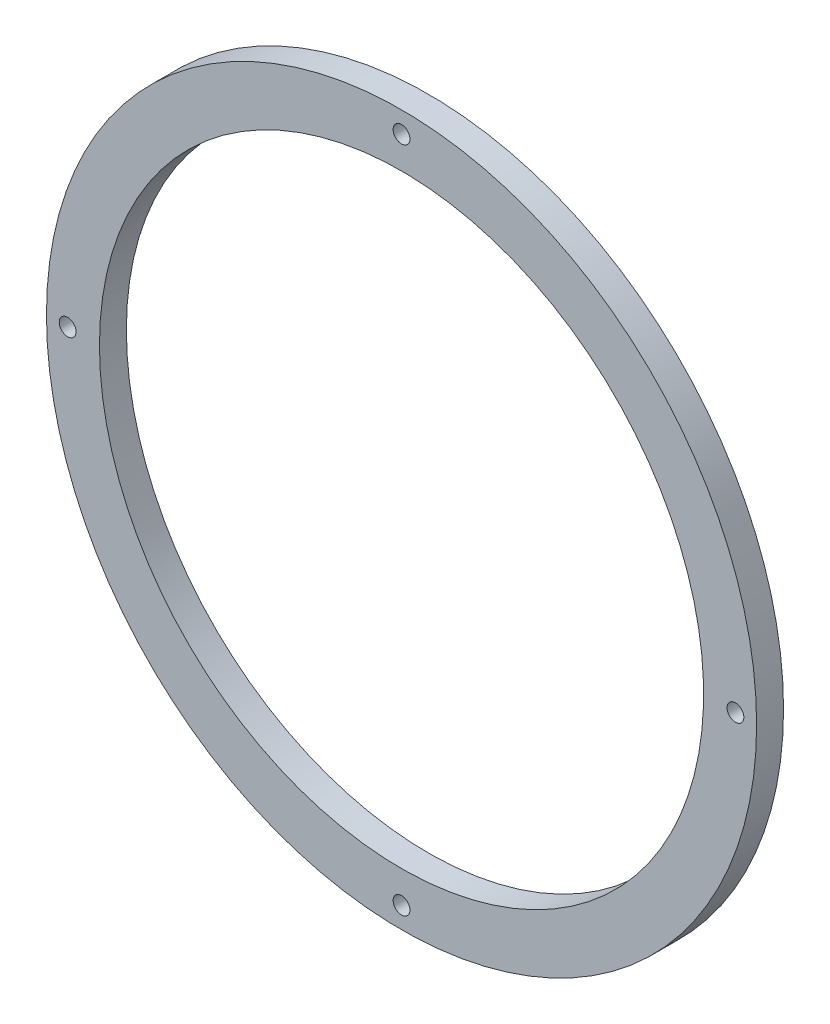
ISO-10303-21;
HEADER;
FILE_DESCRIPTION(('STEP AP214'),'2;1');
FILE_NAME('part.step','',(''),(''),'','','');
FILE_SCHEMA(('AUTOMOTIVE_DESIGN { 1 0 10303 214 1 1 1 1 }'));
ENDSEC;
DATA;
#1=APPLICATION_CONTEXT('core data for automotive mechanical design processes');
#2=APPLICATION_PROTOCOL_DEFINITION('international standard','automotive_design',2000,#1);
#3=PRODUCT_CONTEXT('',#1,'mechanical');
#4=PRODUCT('Part','Part','',(#3));
#5=PRODUCT_RELATED_PRODUCT_CATEGORY('part','',(#4));
#6=PRODUCT_DEFINITION_FORMATION('','',#4);
#7=PRODUCT_DEFINITION_CONTEXT('part definition',#1,'design');
#8=PRODUCT_DEFINITION('design','',#6,#7);
#9=PRODUCT_DEFINITION_SHAPE('','',#8);
#10=(LENGTH_UNIT() NAMED_UNIT(*) SI_UNIT(.MILLI.,.METRE.));
#11=(NAMED_UNIT(*) PLANE_ANGLE_UNIT() SI_UNIT($,.RADIAN.));
#12=(NAMED_UNIT(*) SI_UNIT($,.STERADIAN.) SOLID_ANGLE_UNIT());
#13=UNCERTAINTY_MEASURE_WITH_UNIT(LENGTH_MEASURE(1.E-05),#10,'distance_accuracy_value','');
#14=(GEOMETRIC_REPRESENTATION_CONTEXT(3) GLOBAL_UNCERTAINTY_ASSIGNED_CONTEXT((#13)) GLOBAL_UNIT_ASSIGNED_CONTEXT((#10,
#11,#12)) REPRESENTATION_CONTEXT('',''));
#15=CARTESIAN_POINT('',(0.,0.,0.));
#16=DIRECTION('',(0.,0.,1.));
#17=DIRECTION('',(1.,0.,0.));
#18=AXIS2_PLACEMENT_3D('',#15,#16,#17);
#19=CARTESIAN_POINT('',(0.,0.,7.62));
#20=DIRECTION('',(0.,0.,1.));
#21=DIRECTION('',(1.,0.,0.));
#22=AXIS2_PLACEMENT_3D('',#19,#20,#21);
#23=PLANE('',#22);
#24=CARTESIAN_POINT('',(0.,-94.5,7.62));
#25=DIRECTION('',(0.,0.,1.));
#26=DIRECTION('',(1.,0.,0.));
#27=AXIS2_PLACEMENT_3D('',#24,#25,#26);
#28=CIRCLE('',#27,2.38125);
#29=CARTESIAN_POINT('',(-2.38124999999996,-94.5,7.62));
#30=VERTEX_POINT('',#29);
#31=EDGE_CURVE('E61',#30,#30,#28,.T.);
#32=ORIENTED_EDGE('',*,*,#31,.F.);
#33=EDGE_LOOP('',(#32));
#34=FACE_BOUND('',#33,.T.);
#35=CARTESIAN_POINT('',(0.,94.5,7.62));
#36=DIRECTION('',(0.,0.,1.));
#37=DIRECTION('',(1.,0.,0.));
#38=AXIS2_PLACEMENT_3D('',#35,#36,#37);
#39=CIRCLE('',#38,2.38125);
#40=CARTESIAN_POINT('',(-2.38125,94.5,7.62));
#41=VERTEX_POINT('',#40);
#42=EDGE_CURVE('E49',#41,#41,#39,.T.);
#43=ORIENTED_EDGE('',*,*,#42,.F.);
#44=EDGE_LOOP('',(#43));
#45=FACE_BOUND('',#44,.T.);
#46=CARTESIAN_POINT('',(0.,0.,7.62));
#47=DIRECTION('',(0.,0.,1.));
#48=DIRECTION('',(1.,0.,0.));
#49=AXIS2_PLACEMENT_3D('',#46,#47,#48);
#50=CIRCLE('',#49,100.5);
#51=CARTESIAN_POINT('',(-100.5,0.,7.62));
#52=VERTEX_POINT('',#51);
#53=EDGE_CURVE('E10',#52,#52,#50,.T.);
#54=ORIENTED_EDGE('',*,*,#53,.T.);
#55=EDGE_LOOP('',(#54));
#56=FACE_BOUND('',#55,.T.);
#57=CARTESIAN_POINT('',(0.,0.,7.62));
#58=DIRECTION('',(0.,0.,1.));
#59=DIRECTION('',(1.,0.,0.));
#60=AXIS2_PLACEMENT_3D('',#57,#58,#59);
#61=CIRCLE('',#60,85.5000000000001);
#62=CARTESIAN_POINT('',(-85.5000000000001,0.,7.62));
#63=VERTEX_POINT('',#62);
#64=EDGE_CURVE('E44',#63,#63,#61,.T.);
#65=ORIENTED_EDGE('',*,*,#64,.F.);
#66=EDGE_LOOP('',(#65));
#67=FACE_BOUND('',#66,.T.);
#68=CARTESIAN_POINT('',(94.5,0.,7.62));
#69=DIRECTION('',(0.,0.,1.));
#70=DIRECTION('',(1.,0.,0.));
#71=AXIS2_PLACEMENT_3D('',#68,#69,#70);
#72=CIRCLE('',#71,2.38125000000001);
#73=CARTESIAN_POINT('',(92.11875,0.,7.62));
#74=VERTEX_POINT('',#73);
#75=EDGE_CURVE('E55',#74,#74,#72,.T.);
#76=ORIENTED_EDGE('',*,*,#75,.F.);
#77=EDGE_LOOP('',(#76));
#78=FACE_BOUND('',#77,.T.);
#79=CARTESIAN_POINT('',(-94.5,0.,7.62));
#80=DIRECTION('',(0.,0.,1.));
#81=DIRECTION('',(1.,0.,0.));
#82=AXIS2_PLACEMENT_3D('',#79,#80,#81);
#83=CIRCLE('',#82,2.38125000000001);
#84=CARTESIAN_POINT('',(-96.88125,0.,7.62));
#85=VERTEX_POINT('',#84);
#86=EDGE_CURVE('E67',#85,#85,#83,.T.);
#87=ORIENTED_EDGE('',*,*,#86,.F.);
#88=EDGE_LOOP('',(#87));
#89=FACE_BOUND('',#88,.T.);
#90=ADVANCED_FACE('F33',(#34,#45,#56,#67,#78,#89),#23,.T.);
#91=CARTESIAN_POINT('',(0.,0.,0.));
#92=DIRECTION('',(0.,0.,1.));
#93=DIRECTION('',(1.,0.,0.));
#94=AXIS2_PLACEMENT_3D('',#91,#92,#93);
#95=PLANE('',#94);
#96=CARTESIAN_POINT('',(0.,0.,0.));
#97=DIRECTION('',(0.,0.,1.));
#98=DIRECTION('',(1.,0.,0.));
#99=AXIS2_PLACEMENT_3D('',#96,#97,#98);
#100=CIRCLE('',#99,100.5);
#101=CARTESIAN_POINT('',(-100.5,0.,0.));
#102=VERTEX_POINT('',#101);
#103=EDGE_CURVE('E37',#102,#102,#100,.T.);
#104=ORIENTED_EDGE('',*,*,#103,.F.);
#105=EDGE_LOOP('',(#104));
#106=FACE_BOUND('',#105,.T.);
#107=CARTESIAN_POINT('',(0.,0.,0.));
#108=DIRECTION('',(0.,0.,1.));
#109=DIRECTION('',(1.,0.,0.));
#110=AXIS2_PLACEMENT_3D('',#107,#108,#109);
#111=CIRCLE('',#110,85.5000000000001);
#112=CARTESIAN_POINT('',(-85.5000000000001,0.,0.));
#113=VERTEX_POINT('',#112);
#114=EDGE_CURVE('E46',#113,#113,#111,.T.);
#115=ORIENTED_EDGE('',*,*,#114,.T.);
#116=EDGE_LOOP('',(#115));
#117=FACE_BOUND('',#116,.T.);
#118=CARTESIAN_POINT('',(0.,94.5,0.));
#119=DIRECTION('',(0.,0.,1.));
#120=DIRECTION('',(1.,0.,0.));
#121=AXIS2_PLACEMENT_3D('',#118,#119,#120);
#122=CIRCLE('',#121,2.38125);
#123=CARTESIAN_POINT('',(-2.38125,94.5,0.));
#124=VERTEX_POINT('',#123);
#125=EDGE_CURVE('E52',#124,#124,#122,.T.);
#126=ORIENTED_EDGE('',*,*,#125,.T.);
#127=EDGE_LOOP('',(#126));
#128=FACE_BOUND('',#127,.T.);
#129=CARTESIAN_POINT('',(94.5,0.,0.));
#130=DIRECTION('',(0.,0.,1.));
#131=DIRECTION('',(1.,0.,0.));
#132=AXIS2_PLACEMENT_3D('',#129,#130,#131);
#133=CIRCLE('',#132,2.38125000000001);
#134=CARTESIAN_POINT('',(92.11875,0.,0.));
#135=VERTEX_POINT('',#134);
#136=EDGE_CURVE('E58',#135,#135,#133,.T.);
#137=ORIENTED_EDGE('',*,*,#136,.T.);
#138=EDGE_LOOP('',(#137));
#139=FACE_BOUND('',#138,.T.);
#140=CARTESIAN_POINT('',(0.,-94.5,0.));
#141=DIRECTION('',(0.,0.,1.));
#142=DIRECTION('',(1.,0.,0.));
#143=AXIS2_PLACEMENT_3D('',#140,#141,#142);
#144=CIRCLE('',#143,2.38125);
#145=CARTESIAN_POINT('',(-2.38124999999996,-94.5,0.));
#146=VERTEX_POINT('',#145);
#147=EDGE_CURVE('E64',#146,#146,#144,.T.);
#148=ORIENTED_EDGE('',*,*,#147,.T.);
#149=EDGE_LOOP('',(#148));
#150=FACE_BOUND('',#149,.T.);
#151=CARTESIAN_POINT('',(-94.5,0.,0.));
#152=DIRECTION('',(0.,0.,1.));
#153=DIRECTION('',(1.,0.,0.));
#154=AXIS2_PLACEMENT_3D('',#151,#152,#153);
#155=CIRCLE('',#154,2.38125000000001);
#156=CARTESIAN_POINT('',(-96.88125,0.,0.));
#157=VERTEX_POINT('',#156);
#158=EDGE_CURVE('E70',#157,#157,#155,.T.);
#159=ORIENTED_EDGE('',*,*,#158,.T.);
#160=EDGE_LOOP('',(#159));
#161=FACE_BOUND('',#160,.T.);
#162=ADVANCED_FACE('F80',(#106,#117,#128,#139,#150,#161),#95,.F.);
#163=CARTESIAN_POINT('',(0.,0.,7.62));
#164=DIRECTION('',(0.,0.,-1.));
#165=DIRECTION('',(-1.,0.,0.));
#166=AXIS2_PLACEMENT_3D('',#163,#164,#165);
#167=CYLINDRICAL_SURFACE('',#166,100.5);
#168=CARTESIAN_POINT('',(-100.5,0.,7.62));
#169=CARTESIAN_POINT('',(-100.5,0.,7.540625));
#170=CARTESIAN_POINT('',(-100.5,0.,7.46125));
#171=CARTESIAN_POINT('',(-100.5,0.,7.3025));
#172=CARTESIAN_POINT('',(-100.5,0.,7.223125));
#173=CARTESIAN_POINT('',(-100.5,0.,7.064375));
#174=CARTESIAN_POINT('',(-100.5,0.,6.985));
#175=CARTESIAN_POINT('',(-100.5,0.,6.82625));
#176=CARTESIAN_POINT('',(-100.5,0.,6.746875));
#177=CARTESIAN_POINT('',(-100.5,0.,6.588125));
#178=CARTESIAN_POINT('',(-100.5,0.,6.50875));
#179=CARTESIAN_POINT('',(-100.5,0.,6.35));
#180=CARTESIAN_POINT('',(-100.5,0.,6.270625));
#181=CARTESIAN_POINT('',(-100.5,0.,6.111875));
#182=CARTESIAN_POINT('',(-100.5,0.,6.0325));
#183=CARTESIAN_POINT('',(-100.5,0.,5.87375));
#184=CARTESIAN_POINT('',(-100.5,0.,5.794375));
#185=CARTESIAN_POINT('',(-100.5,0.,5.635625));
#186=CARTESIAN_POINT('',(-100.5,0.,5.55625));
#187=CARTESIAN_POINT('',(-100.5,0.,5.3975));
#188=CARTESIAN_POINT('',(-100.5,0.,5.318125));
#189=CARTESIAN_POINT('',(-100.5,0.,5.159375));
#190=CARTESIAN_POINT('',(-100.5,0.,5.08));
#191=CARTESIAN_POINT('',(-100.5,0.,4.92125));
#192=CARTESIAN_POINT('',(-100.5,0.,4.841875));
#193=CARTESIAN_POINT('',(-100.5,0.,4.683125));
#194=CARTESIAN_POINT('',(-100.5,0.,4.60375));
#195=CARTESIAN_POINT('',(-100.5,0.,4.445));
#196=CARTESIAN_POINT('',(-100.5,0.,4.365625));
#197=CARTESIAN_POINT('',(-100.5,0.,4.206875));
#198=CARTESIAN_POINT('',(-100.5,0.,4.1275));
#199=CARTESIAN_POINT('',(-100.5,0.,3.96875));
#200=CARTESIAN_POINT('',(-100.5,0.,3.889375));
#201=CARTESIAN_POINT('',(-100.5,0.,3.730625));
#202=CARTESIAN_POINT('',(-100.5,0.,3.65125));
#203=CARTESIAN_POINT('',(-100.5,0.,3.4925));
#204=CARTESIAN_POINT('',(-100.5,0.,3.413125));
#205=CARTESIAN_POINT('',(-100.5,0.,3.254375));
#206=CARTESIAN_POINT('',(-100.5,0.,3.175));
#207=CARTESIAN_POINT('',(-100.5,0.,3.01625));
#208=CARTESIAN_POINT('',(-100.5,0.,2.936875));
#209=CARTESIAN_POINT('',(-100.5,0.,2.778125));
#210=CARTESIAN_POINT('',(-100.5,0.,2.69875));
#211=CARTESIAN_POINT('',(-100.5,0.,2.54));
#212=CARTESIAN_POINT('',(-100.5,0.,2.460625));
#213=CARTESIAN_POINT('',(-100.5,0.,2.301875));
#214=CARTESIAN_POINT('',(-100.5,0.,2.2225));
#215=CARTESIAN_POINT('',(-100.5,0.,2.06375));
#216=CARTESIAN_POINT('',(-100.5,0.,1.984375));
#217=CARTESIAN_POINT('',(-100.5,0.,1.825625));
#218=CARTESIAN_POINT('',(-100.5,0.,1.74625));
#219=CARTESIAN_POINT('',(-100.5,0.,1.5875));
#220=CARTESIAN_POINT('',(-100.5,0.,1.508125));
#221=CARTESIAN_POINT('',(-100.5,0.,1.349375));
#222=CARTESIAN_POINT('',(-100.5,0.,1.27));
#223=CARTESIAN_POINT('',(-100.5,0.,1.11125));
#224=CARTESIAN_POINT('',(-100.5,0.,1.031875));
#225=CARTESIAN_POINT('',(-100.5,0.,0.873125));
#226=CARTESIAN_POINT('',(-100.5,0.,0.79375));
#227=CARTESIAN_POINT('',(-100.5,0.,0.635));
#228=CARTESIAN_POINT('',(-100.5,0.,0.555625));
#229=CARTESIAN_POINT('',(-100.5,0.,0.396875));
#230=CARTESIAN_POINT('',(-100.5,0.,0.3175));
#231=CARTESIAN_POINT('',(-100.5,0.,0.15875));
#232=CARTESIAN_POINT('',(-100.5,0.,0.0793749999999999));
#233=CARTESIAN_POINT('',(-100.5,0.,0.));
#234=B_SPLINE_CURVE_WITH_KNOTS('',3,(#168,#169,#170,#171,#172,#173,#174,#175,#176,#177,#178,
#179,#180,#181,#182,#183,#184,#185,#186,#187,#188,#189,#190,#191,#192,#193,#194,#195,#196,#197,
#198,#199,#200,#201,#202,#203,#204,#205,#206,#207,#208,#209,#210,#211,#212,#213,#214,#215,#216,
#217,#218,#219,#220,#221,#222,#223,#224,#225,#226,#227,#228,#229,#230,#231,#232,#233),
.UNSPECIFIED.,.F.,.F.,(4,2,2,2,2,2,2,2,2,2,2,2,2,2,2,2,2,2,2,2,2,2,2,2,2,2,2,2,2,2,2,2,4),(0.,
0.238125,0.476249999999999,0.714375,0.952499999999999,1.190625,1.42875,1.666875,1.905,2.143125,
2.38125,2.619375,2.8575,3.095625,3.33375,3.571875,3.81,4.048125,4.28625,4.524375,4.7625,
5.000625,5.23875,5.476875,5.715,5.953125,6.19125,6.429375,6.6675,6.905625,7.14375,7.381875,
7.62),.UNSPECIFIED.);
#235=EDGE_CURVE('BSEAM35',#52,#102,#234,.T.);
#236=ORIENTED_EDGE('',*,*,#53,.F.);
#237=ORIENTED_EDGE('',*,*,#103,.T.);
#238=ORIENTED_EDGE('',*,*,#235,.T.);
#239=ORIENTED_EDGE('',*,*,#235,.F.);
#240=EDGE_LOOP('',(#236,#238,#237,#239));
#241=FACE_BOUND('',#240,.T.);
#242=ADVANCED_FACE('F35',(#241),#167,.T.);
#243=CARTESIAN_POINT('',(0.,0.,7.62));
#244=DIRECTION('',(0.,0.,-1.));
#245=DIRECTION('',(-1.,0.,0.));
#246=AXIS2_PLACEMENT_3D('',#243,#244,#245);
#247=CYLINDRICAL_SURFACE('',#246,85.5000000000001);
#248=CARTESIAN_POINT('',(-85.5000000000001,0.,7.62));
#249=CARTESIAN_POINT('',(-85.5000000000001,0.,7.540625));
#250=CARTESIAN_POINT('',(-85.5000000000001,0.,7.46125));
#251=CARTESIAN_POINT('',(-85.5000000000001,0.,7.3025));
#252=CARTESIAN_POINT('',(-85.5000000000001,0.,7.223125));
#253=CARTESIAN_POINT('',(-85.5000000000001,0.,7.064375));
#254=CARTESIAN_POINT('',(-85.5000000000001,0.,6.985));
#255=CARTESIAN_POINT('',(-85.5000000000001,0.,6.82625));
#256=CARTESIAN_POINT('',(-85.5000000000001,0.,6.746875));
#257=CARTESIAN_POINT('',(-85.5000000000001,0.,6.588125));
#258=CARTESIAN_POINT('',(-85.5000000000001,0.,6.50875));
#259=CARTESIAN_POINT('',(-85.5000000000001,0.,6.35));
#260=CARTESIAN_POINT('',(-85.5000000000001,0.,6.270625));
#261=CARTESIAN_POINT('',(-85.5000000000001,0.,6.111875));
#262=CARTESIAN_POINT('',(-85.5000000000001,0.,6.0325));
#263=CARTESIAN_POINT('',(-85.5000000000001,0.,5.87375));
#264=CARTESIAN_POINT('',(-85.5000000000001,0.,5.794375));
#265=CARTESIAN_POINT('',(-85.5000000000001,0.,5.635625));
#266=CARTESIAN_POINT('',(-85.5000000000001,0.,5.55625));
#267=CARTESIAN_POINT('',(-85.5000000000001,0.,5.3975));
#268=CARTESIAN_POINT('',(-85.5000000000001,0.,5.318125));
#269=CARTESIAN_POINT('',(-85.5000000000001,0.,5.159375));
#270=CARTESIAN_POINT('',(-85.5000000000001,0.,5.08));
#271=CARTESIAN_POINT('',(-85.5000000000001,0.,4.92125));
#272=CARTESIAN_POINT('',(-85.5000000000001,0.,4.841875));
#273=CARTESIAN_POINT('',(-85.5000000000001,0.,4.683125));
#274=CARTESIAN_POINT('',(-85.5000000000001,0.,4.60375));
#275=CARTESIAN_POINT('',(-85.5000000000001,0.,4.445));
#276=CARTESIAN_POINT('',(-85.5000000000001,0.,4.365625));
#277=CARTESIAN_POINT('',(-85.5000000000001,0.,4.206875));
#278=CARTESIAN_POINT('',(-85.5000000000001,0.,4.1275));
#279=CARTESIAN_POINT('',(-85.5000000000001,0.,3.96875));
#280=CARTESIAN_POINT('',(-85.5000000000001,0.,3.889375));
#281=CARTESIAN_POINT('',(-85.5000000000001,0.,3.730625));
#282=CARTESIAN_POINT('',(-85.5000000000001,0.,3.65125));
#283=CARTESIAN_POINT('',(-85.5000000000001,0.,3.4925));
#284=CARTESIAN_POINT('',(-85.5000000000001,0.,3.413125));
#285=CARTESIAN_POINT('',(-85.5000000000001,0.,3.254375));
#286=CARTESIAN_POINT('',(-85.5000000000001,0.,3.175));
#287=CARTESIAN_POINT('',(-85.5000000000001,0.,3.01625));
#288=CARTESIAN_POINT('',(-85.5000000000001,0.,2.936875));
#289=CARTESIAN_POINT('',(-85.5000000000001,0.,2.778125));
#290=CARTESIAN_POINT('',(-85.5000000000001,0.,2.69875));
#291=CARTESIAN_POINT('',(-85.5000000000001,0.,2.54));
#292=CARTESIAN_POINT('',(-85.5000000000001,0.,2.460625));
#293=CARTESIAN_POINT('',(-85.5000000000001,0.,2.301875));
#294=CARTESIAN_POINT('',(-85.5000000000001,0.,2.2225));
#295=CARTESIAN_POINT('',(-85.5000000000001,0.,2.06375));
#296=CARTESIAN_POINT('',(-85.5000000000001,0.,1.984375));
#297=CARTESIAN_POINT('',(-85.5000000000001,0.,1.825625));
#298=CARTESIAN_POINT('',(-85.5000000000001,0.,1.74625));
#299=CARTESIAN_POINT('',(-85.5000000000001,0.,1.5875));
#300=CARTESIAN_POINT('',(-85.5000000000001,0.,1.508125));
#301=CARTESIAN_POINT('',(-85.5000000000001,0.,1.349375));
#302=CARTESIAN_POINT('',(-85.5000000000001,0.,1.27));
#303=CARTESIAN_POINT('',(-85.5000000000001,0.,1.11125));
#304=CARTESIAN_POINT('',(-85.5000000000001,0.,1.031875));
#305=CARTESIAN_POINT('',(-85.5000000000001,0.,0.873125));
#306=CARTESIAN_POINT('',(-85.5000000000001,0.,0.79375));
#307=CARTESIAN_POINT('',(-85.5000000000001,0.,0.635));
#308=CARTESIAN_POINT('',(-85.5000000000001,0.,0.555625));
#309=CARTESIAN_POINT('',(-85.5000000000001,0.,0.396875));
#310=CARTESIAN_POINT('',(-85.5000000000001,0.,0.3175));
#311=CARTESIAN_POINT('',(-85.5000000000001,0.,0.15875));
#312=CARTESIAN_POINT('',(-85.5000000000001,0.,0.0793749999999999));
#313=CARTESIAN_POINT('',(-85.5000000000001,0.,0.));
#314=B_SPLINE_CURVE_WITH_KNOTS('',3,(#248,#249,#250,#251,#252,#253,#254,#255,#256,#257,#258,
#259,#260,#261,#262,#263,#264,#265,#266,#267,#268,#269,#270,#271,#272,#273,#274,#275,#276,#277,
#278,#279,#280,#281,#282,#283,#284,#285,#286,#287,#288,#289,#290,#291,#292,#293,#294,#295,#296,
#297,#298,#299,#300,#301,#302,#303,#304,#305,#306,#307,#308,#309,#310,#311,#312,#313),
.UNSPECIFIED.,.F.,.F.,(4,2,2,2,2,2,2,2,2,2,2,2,2,2,2,2,2,2,2,2,2,2,2,2,2,2,2,2,2,2,2,2,4),(0.,
0.238125,0.476249999999999,0.714375,0.952499999999999,1.190625,1.42875,1.666875,1.905,2.143125,
2.38125,2.619375,2.8575,3.095625,3.33375,3.571875,3.81,4.048125,4.28625,4.524375,4.7625,
5.000625,5.23875,5.476875,5.715,5.953125,6.19125,6.429375,6.6675,6.905625,7.14375,7.381875,
7.62),.UNSPECIFIED.);
#315=EDGE_CURVE('BSEAM90',#63,#113,#314,.T.);
#316=ORIENTED_EDGE('',*,*,#64,.T.);
#317=ORIENTED_EDGE('',*,*,#114,.F.);
#318=ORIENTED_EDGE('',*,*,#315,.T.);
#319=ORIENTED_EDGE('',*,*,#315,.F.);
#320=EDGE_LOOP('',(#316,#318,#317,#319));
#321=FACE_BOUND('',#320,.T.);
#322=ADVANCED_FACE('F90',(#321),#247,.F.);
#323=CARTESIAN_POINT('',(0.,94.5,7.62));
#324=DIRECTION('',(0.,0.,-1.));
#325=DIRECTION('',(-1.,0.,0.));
#326=AXIS2_PLACEMENT_3D('',#323,#324,#325);
#327=CYLINDRICAL_SURFACE('',#326,2.38125);
#328=CARTESIAN_POINT('',(-2.38125,94.5,7.62));
#329=CARTESIAN_POINT('',(-2.38125,94.5,7.540625));
#330=CARTESIAN_POINT('',(-2.38125,94.5,7.46125));
#331=CARTESIAN_POINT('',(-2.38125,94.5,7.3025));
#332=CARTESIAN_POINT('',(-2.38125,94.5,7.223125));
#333=CARTESIAN_POINT('',(-2.38125,94.5,7.064375));
#334=CARTESIAN_POINT('',(-2.38125,94.5,6.985));
#335=CARTESIAN_POINT('',(-2.38125,94.5,6.82625));
#336=CARTESIAN_POINT('',(-2.38125,94.5,6.746875));
#337=CARTESIAN_POINT('',(-2.38125,94.5,6.588125));
#338=CARTESIAN_POINT('',(-2.38125,94.5,6.50875));
#339=CARTESIAN_POINT('',(-2.38125,94.5,6.35));
#340=CARTESIAN_POINT('',(-2.38125,94.5,6.270625));
#341=CARTESIAN_POINT('',(-2.38125,94.5,6.111875));
#342=CARTESIAN_POINT('',(-2.38125,94.5,6.0325));
#343=CARTESIAN_POINT('',(-2.38125,94.5,5.87375));
#344=CARTESIAN_POINT('',(-2.38125,94.5,5.794375));
#345=CARTESIAN_POINT('',(-2.38125,94.5,5.635625));
#346=CARTESIAN_POINT('',(-2.38125,94.5,5.55625));
#347=CARTESIAN_POINT('',(-2.38125,94.5,5.3975));
#348=CARTESIAN_POINT('',(-2.38125,94.5,5.318125));
#349=CARTESIAN_POINT('',(-2.38125,94.5,5.159375));
#350=CARTESIAN_POINT('',(-2.38125,94.5,5.08));
#351=CARTESIAN_POINT('',(-2.38125,94.5,4.92125));
#352=CARTESIAN_POINT('',(-2.38125,94.5,4.841875));
#353=CARTESIAN_POINT('',(-2.38125,94.5,4.683125));
#354=CARTESIAN_POINT('',(-2.38125,94.5,4.60375));
#355=CARTESIAN_POINT('',(-2.38125,94.5,4.445));
#356=CARTESIAN_POINT('',(-2.38125,94.5,4.365625));
#357=CARTESIAN_POINT('',(-2.38125,94.5,4.206875));
#358=CARTESIAN_POINT('',(-2.38125,94.5,4.1275));
#359=CARTESIAN_POINT('',(-2.38125,94.5,3.96875));
#360=CARTESIAN_POINT('',(-2.38125,94.5,3.889375));
#361=CARTESIAN_POINT('',(-2.38125,94.5,3.730625));
#362=CARTESIAN_POINT('',(-2.38125,94.5,3.65125));
#363=CARTESIAN_POINT('',(-2.38125,94.5,3.4925));
#364=CARTESIAN_POINT('',(-2.38125,94.5,3.413125));
#365=CARTESIAN_POINT('',(-2.38125,94.5,3.254375));
#366=CARTESIAN_POINT('',(-2.38125,94.5,3.175));
#367=CARTESIAN_POINT('',(-2.38125,94.5,3.01625));
#368=CARTESIAN_POINT('',(-2.38125,94.5,2.936875));
#369=CARTESIAN_POINT('',(-2.38125,94.5,2.778125));
#370=CARTESIAN_POINT('',(-2.38125,94.5,2.69875));
#371=CARTESIAN_POINT('',(-2.38125,94.5,2.54));
#372=CARTESIAN_POINT('',(-2.38125,94.5,2.460625));
#373=CARTESIAN_POINT('',(-2.38125,94.5,2.301875));
#374=CARTESIAN_POINT('',(-2.38125,94.5,2.2225));
#375=CARTESIAN_POINT('',(-2.38125,94.5,2.06375));
#376=CARTESIAN_POINT('',(-2.38125,94.5,1.984375));
#377=CARTESIAN_POINT('',(-2.38125,94.5,1.825625));
#378=CARTESIAN_POINT('',(-2.38125,94.5,1.74625));
#379=CARTESIAN_POINT('',(-2.38125,94.5,1.5875));
#380=CARTESIAN_POINT('',(-2.38125,94.5,1.508125));
#381=CARTESIAN_POINT('',(-2.38125,94.5,1.349375));
#382=CARTESIAN_POINT('',(-2.38125,94.5,1.27));
#383=CARTESIAN_POINT('',(-2.38125,94.5,1.11125));
#384=CARTESIAN_POINT('',(-2.38125,94.5,1.031875));
#385=CARTESIAN_POINT('',(-2.38125,94.5,0.873125));
#386=CARTESIAN_POINT('',(-2.38125,94.5,0.79375));
#387=CARTESIAN_POINT('',(-2.38125,94.5,0.635));
#388=CARTESIAN_POINT('',(-2.38125,94.5,0.555625));
#389=CARTESIAN_POINT('',(-2.38125,94.5,0.396875));
#390=CARTESIAN_POINT('',(-2.38125,94.5,0.3175));
#391=CARTESIAN_POINT('',(-2.38125,94.5,0.15875));
#392=CARTESIAN_POINT('',(-2.38125,94.5,0.0793749999999999));
#393=CARTESIAN_POINT('',(-2.38125,94.5,0.));
#394=B_SPLINE_CURVE_WITH_KNOTS('',3,(#328,#329,#330,#331,#332,#333,#334,#335,#336,#337,#338,
#339,#340,#341,#342,#343,#344,#345,#346,#347,#348,#349,#350,#351,#352,#353,#354,#355,#356,#357,
#358,#359,#360,#361,#362,#363,#364,#365,#366,#367,#368,#369,#370,#371,#372,#373,#374,#375,#376,
#377,#378,#379,#380,#381,#382,#383,#384,#385,#386,#387,#388,#389,#390,#391,#392,#393),
.UNSPECIFIED.,.F.,.F.,(4,2,2,2,2,2,2,2,2,2,2,2,2,2,2,2,2,2,2,2,2,2,2,2,2,2,2,2,2,2,2,2,4),(0.,
0.238125,0.47625,0.714375000000001,0.9525,1.190625,1.42875,1.666875,1.905,2.143125,2.38125,
2.619375,2.8575,3.095625,3.33375,3.571875,3.81,4.048125,4.28625,4.524375,4.7625,5.000625,
5.23875,5.476875,5.715,5.953125,6.19125,6.429375,6.6675,6.905625,7.14375,7.381875,7.62),.UNSPECIFIED.);
#395=EDGE_CURVE('BSEAM93',#41,#124,#394,.T.);
#396=ORIENTED_EDGE('',*,*,#42,.T.);
#397=ORIENTED_EDGE('',*,*,#125,.F.);
#398=ORIENTED_EDGE('',*,*,#395,.T.);
#399=ORIENTED_EDGE('',*,*,#395,.F.);
#400=EDGE_LOOP('',(#396,#398,#397,#399));
#401=FACE_BOUND('',#400,.T.);
#402=ADVANCED_FACE('F93',(#401),#327,.F.);
#403=CARTESIAN_POINT('',(94.5,0.,7.62));
#404=DIRECTION('',(0.,0.,-1.));
#405=DIRECTION('',(-1.,0.,0.));
#406=AXIS2_PLACEMENT_3D('',#403,#404,#405);
#407=CYLINDRICAL_SURFACE('',#406,2.38125000000001);
#408=CARTESIAN_POINT('',(92.11875,0.,7.62));
#409=CARTESIAN_POINT('',(92.11875,0.,7.540625));
#410=CARTESIAN_POINT('',(92.11875,0.,7.46125));
#411=CARTESIAN_POINT('',(92.11875,0.,7.3025));
#412=CARTESIAN_POINT('',(92.11875,0.,7.223125));
#413=CARTESIAN_POINT('',(92.11875,0.,7.064375));
#414=CARTESIAN_POINT('',(92.11875,0.,6.985));
#415=CARTESIAN_POINT('',(92.11875,0.,6.82625));
#416=CARTESIAN_POINT('',(92.11875,0.,6.746875));
#417=CARTESIAN_POINT('',(92.11875,0.,6.588125));
#418=CARTESIAN_POINT('',(92.11875,0.,6.50875));
#419=CARTESIAN_POINT('',(92.11875,0.,6.35));
#420=CARTESIAN_POINT('',(92.11875,0.,6.270625));
#421=CARTESIAN_POINT('',(92.11875,0.,6.111875));
#422=CARTESIAN_POINT('',(92.11875,0.,6.0325));
#423=CARTESIAN_POINT('',(92.11875,0.,5.87375));
#424=CARTESIAN_POINT('',(92.11875,0.,5.794375));
#425=CARTESIAN_POINT('',(92.11875,0.,5.635625));
#426=CARTESIAN_POINT('',(92.11875,0.,5.55625));
#427=CARTESIAN_POINT('',(92.11875,0.,5.3975));
#428=CARTESIAN_POINT('',(92.11875,0.,5.318125));
#429=CARTESIAN_POINT('',(92.11875,0.,5.159375));
#430=CARTESIAN_POINT('',(92.11875,0.,5.08));
#431=CARTESIAN_POINT('',(92.11875,0.,4.92125));
#432=CARTESIAN_POINT('',(92.11875,0.,4.841875));
#433=CARTESIAN_POINT('',(92.11875,0.,4.683125));
#434=CARTESIAN_POINT('',(92.11875,0.,4.60375));
#435=CARTESIAN_POINT('',(92.11875,0.,4.445));
#436=CARTESIAN_POINT('',(92.11875,0.,4.365625));
#437=CARTESIAN_POINT('',(92.11875,0.,4.206875));
#438=CARTESIAN_POINT('',(92.11875,0.,4.1275));
#439=CARTESIAN_POINT('',(92.11875,0.,3.96875));
#440=CARTESIAN_POINT('',(92.11875,0.,3.889375));
#441=CARTESIAN_POINT('',(92.11875,0.,3.730625));
#442=CARTESIAN_POINT('',(92.11875,0.,3.65125));
#443=CARTESIAN_POINT('',(92.11875,0.,3.4925));
#444=CARTESIAN_POINT('',(92.11875,0.,3.413125));
#445=CARTESIAN_POINT('',(92.11875,0.,3.254375));
#446=CARTESIAN_POINT('',(92.11875,0.,3.175));
#447=CARTESIAN_POINT('',(92.11875,0.,3.01625));
#448=CARTESIAN_POINT('',(92.11875,0.,2.936875));
#449=CARTESIAN_POINT('',(92.11875,0.,2.778125));
#450=CARTESIAN_POINT('',(92.11875,0.,2.69875));
#451=CARTESIAN_POINT('',(92.11875,0.,2.54));
#452=CARTESIAN_POINT('',(92.11875,0.,2.460625));
#453=CARTESIAN_POINT('',(92.11875,0.,2.301875));
#454=CARTESIAN_POINT('',(92.11875,0.,2.2225));
#455=CARTESIAN_POINT('',(92.11875,0.,2.06375));
#456=CARTESIAN_POINT('',(92.11875,0.,1.984375));
#457=CARTESIAN_POINT('',(92.11875,0.,1.825625));
#458=CARTESIAN_POINT('',(92.11875,0.,1.74625));
#459=CARTESIAN_POINT('',(92.11875,0.,1.5875));
#460=CARTESIAN_POINT('',(92.11875,0.,1.508125));
#461=CARTESIAN_POINT('',(92.11875,0.,1.349375));
#462=CARTESIAN_POINT('',(92.11875,0.,1.27));
#463=CARTESIAN_POINT('',(92.11875,0.,1.11125));
#464=CARTESIAN_POINT('',(92.11875,0.,1.031875));
#465=CARTESIAN_POINT('',(92.11875,0.,0.873125));
#466=CARTESIAN_POINT('',(92.11875,0.,0.79375));
#467=CARTESIAN_POINT('',(92.11875,0.,0.635));
#468=CARTESIAN_POINT('',(92.11875,0.,0.555625));
#469=CARTESIAN_POINT('',(92.11875,0.,0.396875));
#470=CARTESIAN_POINT('',(92.11875,0.,0.3175));
#471=CARTESIAN_POINT('',(92.11875,0.,0.15875));
#472=CARTESIAN_POINT('',(92.11875,0.,0.0793749999999999));
#473=CARTESIAN_POINT('',(92.11875,0.,0.));
#474=B_SPLINE_CURVE_WITH_KNOTS('',3,(#408,#409,#410,#411,#412,#413,#414,#415,#416,#417,#418,
#419,#420,#421,#422,#423,#424,#425,#426,#427,#428,#429,#430,#431,#432,#433,#434,#435,#436,#437,
#438,#439,#440,#441,#442,#443,#444,#445,#446,#447,#448,#449,#450,#451,#452,#453,#454,#455,#456,
#457,#458,#459,#460,#461,#462,#463,#464,#465,#466,#467,#468,#469,#470,#471,#472,#473),
.UNSPECIFIED.,.F.,.F.,(4,2,2,2,2,2,2,2,2,2,2,2,2,2,2,2,2,2,2,2,2,2,2,2,2,2,2,2,2,2,2,2,4),(0.,
0.238125,0.47625,0.714375000000001,0.9525,1.190625,1.42875,1.666875,1.905,2.143125,2.38125,
2.619375,2.8575,3.095625,3.33375,3.571875,3.81,4.048125,4.28625,4.524375,4.7625,5.000625,
5.23875,5.476875,5.715,5.953125,6.19125,6.429375,6.6675,6.905625,7.14375,7.381875,7.62),.UNSPECIFIED.);
#475=EDGE_CURVE('BSEAM97',#74,#135,#474,.T.);
#476=ORIENTED_EDGE('',*,*,#75,.T.);
#477=ORIENTED_EDGE('',*,*,#136,.F.);
#478=ORIENTED_EDGE('',*,*,#475,.T.);
#479=ORIENTED_EDGE('',*,*,#475,.F.);
#480=EDGE_LOOP('',(#476,#478,#477,#479));
#481=FACE_BOUND('',#480,.T.);
#482=ADVANCED_FACE('F97',(#481),#407,.F.);
#483=CARTESIAN_POINT('',(0.,-94.5,7.62));
#484=DIRECTION('',(0.,0.,-1.));
#485=DIRECTION('',(-1.,0.,0.));
#486=AXIS2_PLACEMENT_3D('',#483,#484,#485);
#487=CYLINDRICAL_SURFACE('',#486,2.38125);
#488=CARTESIAN_POINT('',(-2.38124999999996,-94.5,7.62));
#489=CARTESIAN_POINT('',(-2.38124999999996,-94.5,7.540625));
#490=CARTESIAN_POINT('',(-2.38124999999996,-94.5,7.46125));
#491=CARTESIAN_POINT('',(-2.38124999999996,-94.5,7.3025));
#492=CARTESIAN_POINT('',(-2.38124999999996,-94.5,7.223125));
#493=CARTESIAN_POINT('',(-2.38124999999996,-94.5,7.064375));
#494=CARTESIAN_POINT('',(-2.38124999999996,-94.5,6.985));
#495=CARTESIAN_POINT('',(-2.38124999999996,-94.5,6.82625));
#496=CARTESIAN_POINT('',(-2.38124999999996,-94.5,6.746875));
#497=CARTESIAN_POINT('',(-2.38124999999996,-94.5,6.588125));
#498=CARTESIAN_POINT('',(-2.38124999999996,-94.5,6.50875));
#499=CARTESIAN_POINT('',(-2.38124999999996,-94.5,6.35));
#500=CARTESIAN_POINT('',(-2.38124999999996,-94.5,6.270625));
#501=CARTESIAN_POINT('',(-2.38124999999996,-94.5,6.111875));
#502=CARTESIAN_POINT('',(-2.38124999999996,-94.5,6.0325));
#503=CARTESIAN_POINT('',(-2.38124999999996,-94.5,5.87375));
#504=CARTESIAN_POINT('',(-2.38124999999996,-94.5,5.794375));
#505=CARTESIAN_POINT('',(-2.38124999999996,-94.5,5.635625));
#506=CARTESIAN_POINT('',(-2.38124999999996,-94.5,5.55625));
#507=CARTESIAN_POINT('',(-2.38124999999996,-94.5,5.3975));
#508=CARTESIAN_POINT('',(-2.38124999999996,-94.5,5.318125));
#509=CARTESIAN_POINT('',(-2.38124999999996,-94.5,5.159375));
#510=CARTESIAN_POINT('',(-2.38124999999996,-94.5,5.08));
#511=CARTESIAN_POINT('',(-2.38124999999996,-94.5,4.92125));
#512=CARTESIAN_POINT('',(-2.38124999999996,-94.5,4.841875));
#513=CARTESIAN_POINT('',(-2.38124999999996,-94.5,4.683125));
#514=CARTESIAN_POINT('',(-2.38124999999996,-94.5,4.60375));
#515=CARTESIAN_POINT('',(-2.38124999999996,-94.5,4.445));
#516=CARTESIAN_POINT('',(-2.38124999999996,-94.5,4.365625));
#517=CARTESIAN_POINT('',(-2.38124999999996,-94.5,4.206875));
#518=CARTESIAN_POINT('',(-2.38124999999996,-94.5,4.1275));
#519=CARTESIAN_POINT('',(-2.38124999999996,-94.5,3.96875));
#520=CARTESIAN_POINT('',(-2.38124999999996,-94.5,3.889375));
#521=CARTESIAN_POINT('',(-2.38124999999996,-94.5,3.730625));
#522=CARTESIAN_POINT('',(-2.38124999999996,-94.5,3.65125));
#523=CARTESIAN_POINT('',(-2.38124999999996,-94.5,3.4925));
#524=CARTESIAN_POINT('',(-2.38124999999996,-94.5,3.413125));
#525=CARTESIAN_POINT('',(-2.38124999999996,-94.5,3.254375));
#526=CARTESIAN_POINT('',(-2.38124999999996,-94.5,3.175));
#527=CARTESIAN_POINT('',(-2.38124999999996,-94.5,3.01625));
#528=CARTESIAN_POINT('',(-2.38124999999996,-94.5,2.936875));
#529=CARTESIAN_POINT('',(-2.38124999999996,-94.5,2.778125));
#530=CARTESIAN_POINT('',(-2.38124999999996,-94.5,2.69875));
#531=CARTESIAN_POINT('',(-2.38124999999996,-94.5,2.54));
#532=CARTESIAN_POINT('',(-2.38124999999996,-94.5,2.460625));
#533=CARTESIAN_POINT('',(-2.38124999999996,-94.5,2.301875));
#534=CARTESIAN_POINT('',(-2.38124999999996,-94.5,2.2225));
#535=CARTESIAN_POINT('',(-2.38124999999996,-94.5,2.06375));
#536=CARTESIAN_POINT('',(-2.38124999999996,-94.5,1.984375));
#537=CARTESIAN_POINT('',(-2.38124999999996,-94.5,1.825625));
#538=CARTESIAN_POINT('',(-2.38124999999996,-94.5,1.74625));
#539=CARTESIAN_POINT('',(-2.38124999999996,-94.5,1.5875));
#540=CARTESIAN_POINT('',(-2.38124999999996,-94.5,1.508125));
#541=CARTESIAN_POINT('',(-2.38124999999996,-94.5,1.349375));
#542=CARTESIAN_POINT('',(-2.38124999999996,-94.5,1.27));
#543=CARTESIAN_POINT('',(-2.38124999999996,-94.5,1.11125));
#544=CARTESIAN_POINT('',(-2.38124999999996,-94.5,1.031875));
#545=CARTESIAN_POINT('',(-2.38124999999996,-94.5,0.873125));
#546=CARTESIAN_POINT('',(-2.38124999999996,-94.5,0.79375));
#547=CARTESIAN_POINT('',(-2.38124999999996,-94.5,0.635));
#548=CARTESIAN_POINT('',(-2.38124999999996,-94.5,0.555625));
#549=CARTESIAN_POINT('',(-2.38124999999996,-94.5,0.396875));
#550=CARTESIAN_POINT('',(-2.38124999999996,-94.5,0.3175));
#551=CARTESIAN_POINT('',(-2.38124999999996,-94.5,0.15875));
#552=CARTESIAN_POINT('',(-2.38124999999996,-94.5,0.0793749999999999));
#553=CARTESIAN_POINT('',(-2.38124999999996,-94.5,0.));
#554=B_SPLINE_CURVE_WITH_KNOTS('',3,(#488,#489,#490,#491,#492,#493,#494,#495,#496,#497,#498,
#499,#500,#501,#502,#503,#504,#505,#506,#507,#508,#509,#510,#511,#512,#513,#514,#515,#516,#517,
#518,#519,#520,#521,#522,#523,#524,#525,#526,#527,#528,#529,#530,#531,#532,#533,#534,#535,#536,
#537,#538,#539,#540,#541,#542,#543,#544,#545,#546,#547,#548,#549,#550,#551,#552,#553),
.UNSPECIFIED.,.F.,.F.,(4,2,2,2,2,2,2,2,2,2,2,2,2,2,2,2,2,2,2,2,2,2,2,2,2,2,2,2,2,2,2,2,4),(0.,
0.238125,0.47625,0.714375000000001,0.9525,1.190625,1.42875,1.666875,1.905,2.143125,2.38125,
2.619375,2.8575,3.095625,3.33375,3.571875,3.81,4.048125,4.28625,4.524375,4.7625,5.000625,
5.23875,5.476875,5.715,5.953125,6.19125,6.429375,6.6675,6.905625,7.14375,7.381875,7.62),.UNSPECIFIED.);
#555=EDGE_CURVE('BSEAM101',#30,#146,#554,.T.);
#556=ORIENTED_EDGE('',*,*,#31,.T.);
#557=ORIENTED_EDGE('',*,*,#147,.F.);
#558=ORIENTED_EDGE('',*,*,#555,.T.);
#559=ORIENTED_EDGE('',*,*,#555,.F.);
#560=EDGE_LOOP('',(#556,#558,#557,#559));
#561=FACE_BOUND('',#560,.T.);
#562=ADVANCED_FACE('F101',(#561),#487,.F.);
#563=CARTESIAN_POINT('',(-94.5,0.,7.62));
#564=DIRECTION('',(0.,0.,-1.));
#565=DIRECTION('',(-1.,0.,0.));
#566=AXIS2_PLACEMENT_3D('',#563,#564,#565);
#567=CYLINDRICAL_SURFACE('',#566,2.38125000000001);
#568=CARTESIAN_POINT('',(-96.88125,0.,7.62));
#569=CARTESIAN_POINT('',(-96.88125,0.,7.540625));
#570=CARTESIAN_POINT('',(-96.88125,0.,7.46125));
#571=CARTESIAN_POINT('',(-96.88125,0.,7.3025));
#572=CARTESIAN_POINT('',(-96.88125,0.,7.223125));
#573=CARTESIAN_POINT('',(-96.88125,0.,7.064375));
#574=CARTESIAN_POINT('',(-96.88125,0.,6.985));
#575=CARTESIAN_POINT('',(-96.88125,0.,6.82625));
#576=CARTESIAN_POINT('',(-96.88125,0.,6.746875));
#577=CARTESIAN_POINT('',(-96.88125,0.,6.588125));
#578=CARTESIAN_POINT('',(-96.88125,0.,6.50875));
#579=CARTESIAN_POINT('',(-96.88125,0.,6.35));
#580=CARTESIAN_POINT('',(-96.88125,0.,6.270625));
#581=CARTESIAN_POINT('',(-96.88125,0.,6.111875));
#582=CARTESIAN_POINT('',(-96.88125,0.,6.0325));
#583=CARTESIAN_POINT('',(-96.88125,0.,5.87375));
#584=CARTESIAN_POINT('',(-96.88125,0.,5.794375));
#585=CARTESIAN_POINT('',(-96.88125,0.,5.635625));
#586=CARTESIAN_POINT('',(-96.88125,0.,5.55625));
#587=CARTESIAN_POINT('',(-96.88125,0.,5.3975));
#588=CARTESIAN_POINT('',(-96.88125,0.,5.318125));
#589=CARTESIAN_POINT('',(-96.88125,0.,5.159375));
#590=CARTESIAN_POINT('',(-96.88125,0.,5.08));
#591=CARTESIAN_POINT('',(-96.88125,0.,4.92125));
#592=CARTESIAN_POINT('',(-96.88125,0.,4.841875));
#593=CARTESIAN_POINT('',(-96.88125,0.,4.683125));
#594=CARTESIAN_POINT('',(-96.88125,0.,4.60375));
#595=CARTESIAN_POINT('',(-96.88125,0.,4.445));
#596=CARTESIAN_POINT('',(-96.88125,0.,4.365625));
#597=CARTESIAN_POINT('',(-96.88125,0.,4.206875));
#598=CARTESIAN_POINT('',(-96.88125,0.,4.1275));
#599=CARTESIAN_POINT('',(-96.88125,0.,3.96875));
#600=CARTESIAN_POINT('',(-96.88125,0.,3.889375));
#601=CARTESIAN_POINT('',(-96.88125,0.,3.730625));
#602=CARTESIAN_POINT('',(-96.88125,0.,3.65125));
#603=CARTESIAN_POINT('',(-96.88125,0.,3.4925));
#604=CARTESIAN_POINT('',(-96.88125,0.,3.413125));
#605=CARTESIAN_POINT('',(-96.88125,0.,3.254375));
#606=CARTESIAN_POINT('',(-96.88125,0.,3.175));
#607=CARTESIAN_POINT('',(-96.88125,0.,3.01625));
#608=CARTESIAN_POINT('',(-96.88125,0.,2.936875));
#609=CARTESIAN_POINT('',(-96.88125,0.,2.778125));
#610=CARTESIAN_POINT('',(-96.88125,0.,2.69875));
#611=CARTESIAN_POINT('',(-96.88125,0.,2.54));
#612=CARTESIAN_POINT('',(-96.88125,0.,2.460625));
#613=CARTESIAN_POINT('',(-96.88125,0.,2.301875));
#614=CARTESIAN_POINT('',(-96.88125,0.,2.2225));
#615=CARTESIAN_POINT('',(-96.88125,0.,2.06375));
#616=CARTESIAN_POINT('',(-96.88125,0.,1.984375));
#617=CARTESIAN_POINT('',(-96.88125,0.,1.825625));
#618=CARTESIAN_POINT('',(-96.88125,0.,1.74625));
#619=CARTESIAN_POINT('',(-96.88125,0.,1.5875));
#620=CARTESIAN_POINT('',(-96.88125,0.,1.508125));
#621=CARTESIAN_POINT('',(-96.88125,0.,1.349375));
#622=CARTESIAN_POINT('',(-96.88125,0.,1.27));
#623=CARTESIAN_POINT('',(-96.88125,0.,1.11125));
#624=CARTESIAN_POINT('',(-96.88125,0.,1.031875));
#625=CARTESIAN_POINT('',(-96.88125,0.,0.873125));
#626=CARTESIAN_POINT('',(-96.88125,0.,0.79375));
#627=CARTESIAN_POINT('',(-96.88125,0.,0.635));
#628=CARTESIAN_POINT('',(-96.88125,0.,0.555625));
#629=CARTESIAN_POINT('',(-96.88125,0.,0.396875));
#630=CARTESIAN_POINT('',(-96.88125,0.,0.3175));
#631=CARTESIAN_POINT('',(-96.88125,0.,0.15875));
#632=CARTESIAN_POINT('',(-96.88125,0.,0.0793749999999999));
#633=CARTESIAN_POINT('',(-96.88125,0.,0.));
#634=B_SPLINE_CURVE_WITH_KNOTS('',3,(#568,#569,#570,#571,#572,#573,#574,#575,#576,#577,#578,
#579,#580,#581,#582,#583,#584,#585,#586,#587,#588,#589,#590,#591,#592,#593,#594,#595,#596,#597,
#598,#599,#600,#601,#602,#603,#604,#605,#606,#607,#608,#609,#610,#611,#612,#613,#614,#615,#616,
#617,#618,#619,#620,#621,#622,#623,#624,#625,#626,#627,#628,#629,#630,#631,#632,#633),
.UNSPECIFIED.,.F.,.F.,(4,2,2,2,2,2,2,2,2,2,2,2,2,2,2,2,2,2,2,2,2,2,2,2,2,2,2,2,2,2,2,2,4),(0.,
0.238125,0.47625,0.714375000000001,0.9525,1.190625,1.42875,1.666875,1.905,2.143125,2.38125,
2.619375,2.8575,3.095625,3.33375,3.571875,3.81,4.048125,4.28625,4.524375,4.7625,5.000625,
5.23875,5.476875,5.715,5.953125,6.19125,6.429375,6.6675,6.905625,7.14375,7.381875,7.62),.UNSPECIFIED.);
#635=EDGE_CURVE('BSEAM76',#85,#157,#634,.T.);
#636=ORIENTED_EDGE('',*,*,#86,.T.);
#637=ORIENTED_EDGE('',*,*,#158,.F.);
#638=ORIENTED_EDGE('',*,*,#635,.T.);
#639=ORIENTED_EDGE('',*,*,#635,.F.);
#640=EDGE_LOOP('',(#636,#638,#637,#639));
#641=FACE_BOUND('',#640,.T.);
#642=ADVANCED_FACE('F76',(#641),#567,.F.);
#643=CLOSED_SHELL('',(#90,#162,#242,#322,#402,#482,#562,#642));
#644=MANIFOLD_SOLID_BREP('B2',#643);
#645=ADVANCED_BREP_SHAPE_REPRESENTATION('',(#18,#644),#14);
#646=SHAPE_DEFINITION_REPRESENTATION(#9,#645);
ENDSEC;
END-ISO-10303-21;
